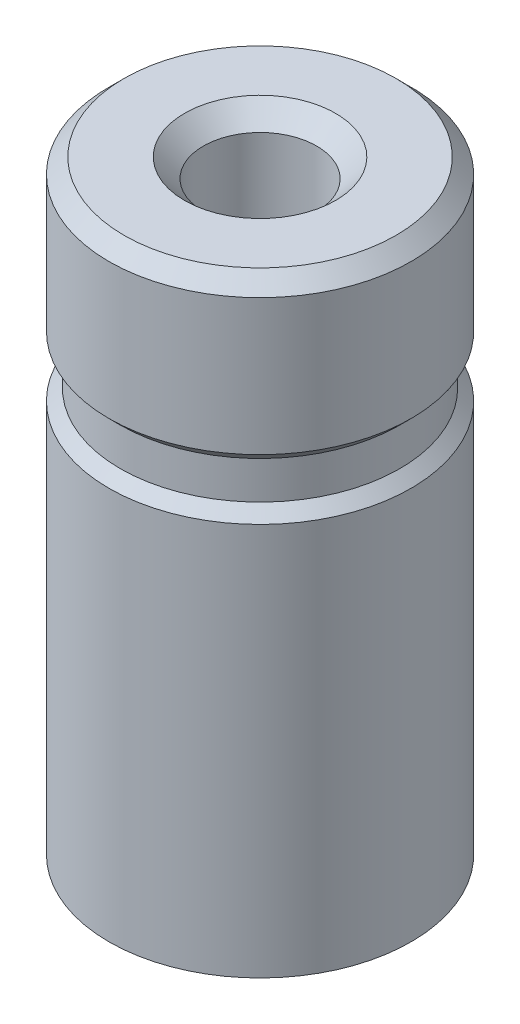
ISO-10303-21;
HEADER;
FILE_DESCRIPTION(('STEP AP214'),'2;1');
FILE_NAME('part.step','',(''),(''),'','','');
FILE_SCHEMA(('AUTOMOTIVE_DESIGN { 1 0 10303 214 1 1 1 1 }'));
ENDSEC;
DATA;
#1=APPLICATION_CONTEXT('core data for automotive mechanical design processes');
#2=APPLICATION_PROTOCOL_DEFINITION('international standard','automotive_design',2000,#1);
#3=PRODUCT_CONTEXT('',#1,'mechanical');
#4=PRODUCT('Part','Part','',(#3));
#5=PRODUCT_RELATED_PRODUCT_CATEGORY('part','',(#4));
#6=PRODUCT_DEFINITION_FORMATION('','',#4);
#7=PRODUCT_DEFINITION_CONTEXT('part definition',#1,'design');
#8=PRODUCT_DEFINITION('design','',#6,#7);
#9=PRODUCT_DEFINITION_SHAPE('','',#8);
#10=(LENGTH_UNIT() NAMED_UNIT(*) SI_UNIT(.MILLI.,.METRE.));
#11=(NAMED_UNIT(*) PLANE_ANGLE_UNIT() SI_UNIT($,.RADIAN.));
#12=(NAMED_UNIT(*) SI_UNIT($,.STERADIAN.) SOLID_ANGLE_UNIT());
#13=UNCERTAINTY_MEASURE_WITH_UNIT(LENGTH_MEASURE(1.E-05),#10,'distance_accuracy_value','');
#14=(GEOMETRIC_REPRESENTATION_CONTEXT(3) GLOBAL_UNCERTAINTY_ASSIGNED_CONTEXT((#13)) GLOBAL_UNIT_ASSIGNED_CONTEXT((#10,
#11,#12)) REPRESENTATION_CONTEXT('',''));
#15=CARTESIAN_POINT('',(0.,0.,0.));
#16=DIRECTION('',(0.,0.,1.));
#17=DIRECTION('',(1.,0.,0.));
#18=AXIS2_PLACEMENT_3D('',#15,#16,#17);
#19=CARTESIAN_POINT('',(0.,5.2,0.));
#20=DIRECTION('',(0.,-1.,0.));
#21=DIRECTION('',(0.,0.,-1.));
#22=AXIS2_PLACEMENT_3D('',#19,#20,#21);
#23=CYLINDRICAL_SURFACE('',#22,2.);
#24=CARTESIAN_POINT('',(0.,5.2,0.));
#25=DIRECTION('',(0.,1.,0.));
#26=DIRECTION('',(0.,0.,1.));
#27=AXIS2_PLACEMENT_3D('',#24,#25,#26);
#28=CIRCLE('',#27,2.);
#29=CARTESIAN_POINT('',(0.,5.2,2.));
#30=VERTEX_POINT('',#29);
#31=EDGE_CURVE('E10',#30,#30,#28,.T.);
#32=ORIENTED_EDGE('',*,*,#31,.F.);
#33=EDGE_LOOP('',(#32));
#34=FACE_BOUND('',#33,.T.);
#35=CARTESIAN_POINT('',(0.,0.,0.));
#36=DIRECTION('',(0.,1.,0.));
#37=DIRECTION('',(0.,0.,1.));
#38=AXIS2_PLACEMENT_3D('',#35,#36,#37);
#39=CIRCLE('',#38,2.);
#40=CARTESIAN_POINT('',(0.,0.,2.));
#41=VERTEX_POINT('',#40);
#42=EDGE_CURVE('E35',#41,#41,#39,.T.);
#43=ORIENTED_EDGE('',*,*,#42,.T.);
#44=EDGE_LOOP('',(#43));
#45=FACE_BOUND('',#44,.T.);
#46=ADVANCED_FACE('F32',(#34,#45),#23,.T.);
#47=CARTESIAN_POINT('',(0.,0.,0.));
#48=DIRECTION('',(0.,1.,0.));
#49=DIRECTION('',(0.,0.,1.));
#50=AXIS2_PLACEMENT_3D('',#47,#48,#49);
#51=PLANE('',#50);
#52=ORIENTED_EDGE('',*,*,#42,.F.);
#53=EDGE_LOOP('',(#52));
#54=FACE_BOUND('',#53,.T.);
#55=ADVANCED_FACE('F114',(#54),#51,.F.);
#56=CARTESIAN_POINT('',(0.,5.2,0.));
#57=DIRECTION('',(0.,-1.,0.));
#58=DIRECTION('',(0.,0.,1.));
#59=AXIS2_PLACEMENT_3D('',#56,#57,#58);
#60=CONICAL_SURFACE('',#59,2.,0.78539816339745);
#61=CARTESIAN_POINT('',(0.,5.35,0.));
#62=DIRECTION('',(0.,1.,0.));
#63=DIRECTION('',(0.,0.,1.));
#64=AXIS2_PLACEMENT_3D('',#61,#62,#63);
#65=CIRCLE('',#64,1.85);
#66=CARTESIAN_POINT('',(0.,5.35,1.85));
#67=VERTEX_POINT('',#66);
#68=EDGE_CURVE('E42',#67,#67,#65,.T.);
#69=ORIENTED_EDGE('',*,*,#68,.F.);
#70=EDGE_LOOP('',(#69));
#71=FACE_BOUND('',#70,.T.);
#72=ORIENTED_EDGE('',*,*,#31,.T.);
#73=EDGE_LOOP('',(#72));
#74=FACE_BOUND('',#73,.T.);
#75=ADVANCED_FACE('F109',(#71,#74),#60,.T.);
#76=CARTESIAN_POINT('',(0.,5.85,0.));
#77=DIRECTION('',(0.,-1.,0.));
#78=DIRECTION('',(0.,0.,-1.));
#79=AXIS2_PLACEMENT_3D('',#76,#77,#78);
#80=CYLINDRICAL_SURFACE('',#79,1.85);
#81=CARTESIAN_POINT('',(0.,5.85,0.));
#82=DIRECTION('',(0.,1.,0.));
#83=DIRECTION('',(0.,0.,1.));
#84=AXIS2_PLACEMENT_3D('',#81,#82,#83);
#85=CIRCLE('',#84,1.85);
#86=CARTESIAN_POINT('',(0.,5.85,1.85));
#87=VERTEX_POINT('',#86);
#88=EDGE_CURVE('E46',#87,#87,#85,.T.);
#89=ORIENTED_EDGE('',*,*,#88,.F.);
#90=EDGE_LOOP('',(#89));
#91=FACE_BOUND('',#90,.T.);
#92=ORIENTED_EDGE('',*,*,#68,.T.);
#93=EDGE_LOOP('',(#92));
#94=FACE_BOUND('',#93,.T.);
#95=ADVANCED_FACE('F103',(#91,#94),#80,.T.);
#96=CARTESIAN_POINT('',(0.,5.85,0.));
#97=DIRECTION('',(0.,1.,0.));
#98=DIRECTION('',(0.,0.,1.));
#99=AXIS2_PLACEMENT_3D('',#96,#97,#98);
#100=CONICAL_SURFACE('',#99,1.85,0.78539816339745);
#101=CARTESIAN_POINT('',(0.,6.,0.));
#102=DIRECTION('',(0.,1.,0.));
#103=DIRECTION('',(0.,0.,1.));
#104=AXIS2_PLACEMENT_3D('',#101,#102,#103);
#105=CIRCLE('',#104,2.);
#106=CARTESIAN_POINT('',(0.,6.,2.));
#107=VERTEX_POINT('',#106);
#108=EDGE_CURVE('E49',#107,#107,#105,.T.);
#109=ORIENTED_EDGE('',*,*,#108,.F.);
#110=EDGE_LOOP('',(#109));
#111=FACE_BOUND('',#110,.T.);
#112=ORIENTED_EDGE('',*,*,#88,.T.);
#113=EDGE_LOOP('',(#112));
#114=FACE_BOUND('',#113,.T.);
#115=ADVANCED_FACE('F97',(#111,#114),#100,.T.);
#116=CARTESIAN_POINT('',(0.,7.8,0.));
#117=DIRECTION('',(0.,-1.,0.));
#118=DIRECTION('',(0.,0.,-1.));
#119=AXIS2_PLACEMENT_3D('',#116,#117,#118);
#120=CYLINDRICAL_SURFACE('',#119,2.);
#121=CARTESIAN_POINT('',(0.,7.8,0.));
#122=DIRECTION('',(0.,1.,0.));
#123=DIRECTION('',(0.,0.,1.));
#124=AXIS2_PLACEMENT_3D('',#121,#122,#123);
#125=CIRCLE('',#124,2.);
#126=CARTESIAN_POINT('',(0.,7.8,2.));
#127=VERTEX_POINT('',#126);
#128=EDGE_CURVE('E52',#127,#127,#125,.T.);
#129=ORIENTED_EDGE('',*,*,#128,.F.);
#130=EDGE_LOOP('',(#129));
#131=FACE_BOUND('',#130,.T.);
#132=ORIENTED_EDGE('',*,*,#108,.T.);
#133=EDGE_LOOP('',(#132));
#134=FACE_BOUND('',#133,.T.);
#135=ADVANCED_FACE('F91',(#131,#134),#120,.T.);
#136=CARTESIAN_POINT('',(0.,7.8,0.));
#137=DIRECTION('',(0.,-1.,0.));
#138=DIRECTION('',(0.,0.,1.));
#139=AXIS2_PLACEMENT_3D('',#136,#137,#138);
#140=CONICAL_SURFACE('',#139,2.,0.78539816339745);
#141=CARTESIAN_POINT('',(0.,8.,0.));
#142=DIRECTION('',(0.,1.,0.));
#143=DIRECTION('',(0.,0.,1.));
#144=AXIS2_PLACEMENT_3D('',#141,#142,#143);
#145=CIRCLE('',#144,1.8);
#146=CARTESIAN_POINT('',(0.,8.,1.8));
#147=VERTEX_POINT('',#146);
#148=EDGE_CURVE('E55',#147,#147,#145,.T.);
#149=ORIENTED_EDGE('',*,*,#148,.F.);
#150=EDGE_LOOP('',(#149));
#151=FACE_BOUND('',#150,.T.);
#152=ORIENTED_EDGE('',*,*,#128,.T.);
#153=EDGE_LOOP('',(#152));
#154=FACE_BOUND('',#153,.T.);
#155=ADVANCED_FACE('F85',(#151,#154),#140,.T.);
#156=CARTESIAN_POINT('',(0.,8.,0.));
#157=DIRECTION('',(0.,1.,0.));
#158=DIRECTION('',(0.,0.,1.));
#159=AXIS2_PLACEMENT_3D('',#156,#157,#158);
#160=PLANE('',#159);
#161=CARTESIAN_POINT('',(0.,8.,0.));
#162=DIRECTION('',(0.,1.,0.));
#163=DIRECTION('',(0.,0.,1.));
#164=AXIS2_PLACEMENT_3D('',#161,#162,#163);
#165=CIRCLE('',#164,1.);
#166=CARTESIAN_POINT('',(0.,8.,1.));
#167=VERTEX_POINT('',#166);
#168=EDGE_CURVE('E58',#167,#167,#165,.T.);
#169=ORIENTED_EDGE('',*,*,#168,.F.);
#170=EDGE_LOOP('',(#169));
#171=FACE_BOUND('',#170,.T.);
#172=ORIENTED_EDGE('',*,*,#148,.T.);
#173=EDGE_LOOP('',(#172));
#174=FACE_BOUND('',#173,.T.);
#175=ADVANCED_FACE('F79',(#171,#174),#160,.T.);
#176=CARTESIAN_POINT('',(0.,8.,0.));
#177=DIRECTION('',(0.,1.,0.));
#178=DIRECTION('',(0.,0.,1.));
#179=AXIS2_PLACEMENT_3D('',#176,#177,#178);
#180=CONICAL_SURFACE('',#179,1.,0.78539816339745);
#181=CARTESIAN_POINT('',(0.,7.75,0.));
#182=DIRECTION('',(0.,1.,0.));
#183=DIRECTION('',(0.,0.,1.));
#184=AXIS2_PLACEMENT_3D('',#181,#182,#183);
#185=CIRCLE('',#184,0.749999999999999);
#186=CARTESIAN_POINT('',(0.,7.75,0.749999999999999));
#187=VERTEX_POINT('',#186);
#188=EDGE_CURVE('E62',#187,#187,#185,.T.);
#189=ORIENTED_EDGE('',*,*,#188,.F.);
#190=EDGE_LOOP('',(#189));
#191=FACE_BOUND('',#190,.T.);
#192=ORIENTED_EDGE('',*,*,#168,.T.);
#193=EDGE_LOOP('',(#192));
#194=FACE_BOUND('',#193,.T.);
#195=ADVANCED_FACE('F73',(#191,#194),#180,.F.);
#196=CARTESIAN_POINT('',(0.,3.75,0.));
#197=DIRECTION('',(0.,1.,0.));
#198=DIRECTION('',(0.,0.,1.));
#199=AXIS2_PLACEMENT_3D('',#196,#197,#198);
#200=CYLINDRICAL_SURFACE('',#199,0.749999999999999);
#201=CARTESIAN_POINT('',(0.,3.75,0.));
#202=DIRECTION('',(0.,1.,0.));
#203=DIRECTION('',(0.,0.,1.));
#204=AXIS2_PLACEMENT_3D('',#201,#202,#203);
#205=CIRCLE('',#204,0.749999999999999);
#206=CARTESIAN_POINT('',(0.,3.75,0.749999999999999));
#207=VERTEX_POINT('',#206);
#208=EDGE_CURVE('E61',#207,#207,#205,.T.);
#209=ORIENTED_EDGE('',*,*,#208,.F.);
#210=EDGE_LOOP('',(#209));
#211=FACE_BOUND('',#210,.T.);
#212=ORIENTED_EDGE('',*,*,#188,.T.);
#213=EDGE_LOOP('',(#212));
#214=FACE_BOUND('',#213,.T.);
#215=ADVANCED_FACE('F70',(#211,#214),#200,.F.);
#216=CARTESIAN_POINT('',(0.,3.75,0.));
#217=DIRECTION('',(0.,1.,0.));
#218=DIRECTION('',(0.,0.,1.));
#219=AXIS2_PLACEMENT_3D('',#216,#217,#218);
#220=PLANE('',#219);
#221=ORIENTED_EDGE('',*,*,#208,.T.);
#222=EDGE_LOOP('',(#221));
#223=FACE_BOUND('',#222,.T.);
#224=ADVANCED_FACE('F68',(#223),#220,.T.);
#225=CLOSED_SHELL('',(#46,#55,#75,#95,#115,#135,#155,#175,#195,#215,#224));
#226=MANIFOLD_SOLID_BREP('B2',#225);
#227=ADVANCED_BREP_SHAPE_REPRESENTATION('',(#18,#226),#14);
#228=SHAPE_DEFINITION_REPRESENTATION(#9,#227);
ENDSEC;
END-ISO-10303-21;
